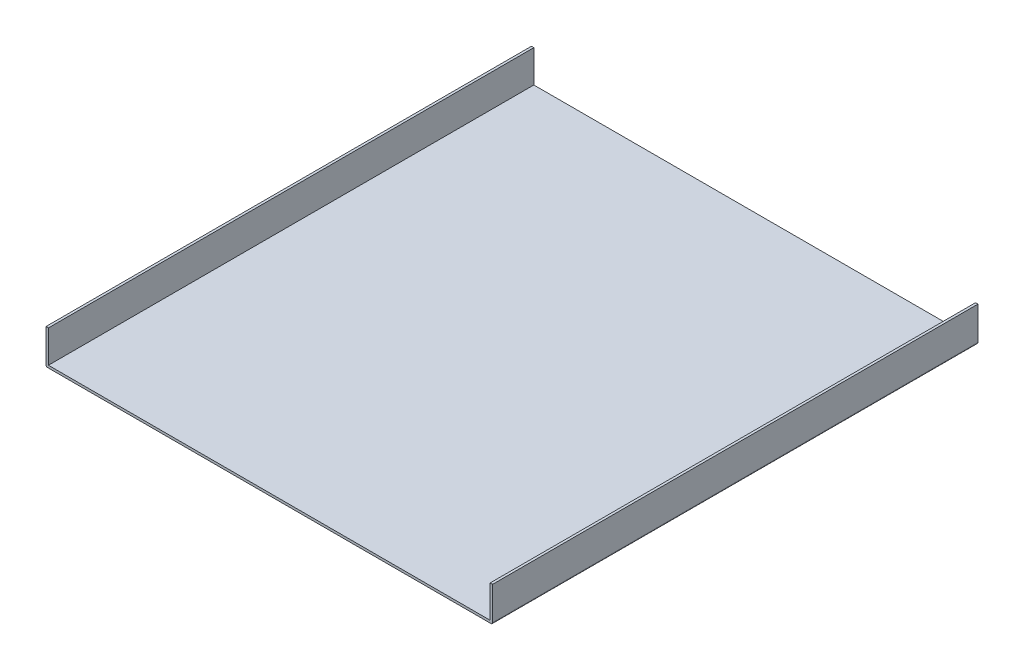
ISO-10303-21;
HEADER;
FILE_DESCRIPTION(('STEP AP214'),'2;1');
FILE_NAME('part.step','',(''),(''),'','','');
FILE_SCHEMA(('AUTOMOTIVE_DESIGN { 1 0 10303 214 1 1 1 1 }'));
ENDSEC;
DATA;
#1=APPLICATION_CONTEXT('core data for automotive mechanical design processes');
#2=APPLICATION_PROTOCOL_DEFINITION('international standard','automotive_design',2000,#1);
#3=PRODUCT_CONTEXT('',#1,'mechanical');
#4=PRODUCT('Part','Part','',(#3));
#5=PRODUCT_RELATED_PRODUCT_CATEGORY('part','',(#4));
#6=PRODUCT_DEFINITION_FORMATION('','',#4);
#7=PRODUCT_DEFINITION_CONTEXT('part definition',#1,'design');
#8=PRODUCT_DEFINITION('design','',#6,#7);
#9=PRODUCT_DEFINITION_SHAPE('','',#8);
#10=(LENGTH_UNIT() NAMED_UNIT(*) SI_UNIT(.MILLI.,.METRE.));
#11=(NAMED_UNIT(*) PLANE_ANGLE_UNIT() SI_UNIT($,.RADIAN.));
#12=(NAMED_UNIT(*) SI_UNIT($,.STERADIAN.) SOLID_ANGLE_UNIT());
#13=UNCERTAINTY_MEASURE_WITH_UNIT(LENGTH_MEASURE(1.E-05),#10,'distance_accuracy_value','');
#14=(GEOMETRIC_REPRESENTATION_CONTEXT(3) GLOBAL_UNCERTAINTY_ASSIGNED_CONTEXT((#13)) GLOBAL_UNIT_ASSIGNED_CONTEXT((#10,
#11,#12)) REPRESENTATION_CONTEXT('',''));
#15=CARTESIAN_POINT('',(0.,0.,0.));
#16=DIRECTION('',(0.,0.,1.));
#17=DIRECTION('',(1.,0.,0.));
#18=AXIS2_PLACEMENT_3D('',#15,#16,#17);
#19=CARTESIAN_POINT('',(0.,1.5,0.));
#20=DIRECTION('',(0.,1.,0.));
#21=DIRECTION('',(0.,0.,1.));
#22=AXIS2_PLACEMENT_3D('',#19,#20,#21);
#23=PLANE('',#22);
#24=DIRECTION('',(1.,0.,0.));
#25=VECTOR('',#24,1.);
#26=CARTESIAN_POINT('',(-138.,1.5,150.));
#27=LINE('',#26,#25);
#28=CARTESIAN_POINT('',(-136.5,1.5,150.));
#29=VERTEX_POINT('',#28);
#30=CARTESIAN_POINT('',(136.5,1.5,150.));
#31=VERTEX_POINT('',#30);
#32=EDGE_CURVE('E189',#29,#31,#27,.T.);
#33=ORIENTED_EDGE('',*,*,#32,.T.);
#34=DIRECTION('',(0.,0.,1.));
#35=VECTOR('',#34,1.);
#36=CARTESIAN_POINT('',(136.5,1.5,150.));
#37=LINE('',#36,#35);
#38=CARTESIAN_POINT('',(136.5,1.5,-150.));
#39=VERTEX_POINT('',#38);
#40=EDGE_CURVE('E146',#39,#31,#37,.T.);
#41=ORIENTED_EDGE('',*,*,#40,.F.);
#42=DIRECTION('',(1.,0.,0.));
#43=VECTOR('',#42,1.);
#44=CARTESIAN_POINT('',(-138.,1.5,-150.));
#45=LINE('',#44,#43);
#46=CARTESIAN_POINT('',(-136.5,1.5,-150.));
#47=VERTEX_POINT('',#46);
#48=EDGE_CURVE('E192',#47,#39,#45,.T.);
#49=ORIENTED_EDGE('',*,*,#48,.F.);
#50=DIRECTION('',(0.,0.,-1.));
#51=VECTOR('',#50,1.);
#52=CARTESIAN_POINT('',(-136.5,1.5,150.));
#53=LINE('',#52,#51);
#54=EDGE_CURVE('E162',#29,#47,#53,.T.);
#55=ORIENTED_EDGE('',*,*,#54,.F.);
#56=EDGE_LOOP('',(#33,#41,#49,#55));
#57=FACE_BOUND('',#56,.T.);
#58=ADVANCED_FACE('F38',(#57),#23,.T.);
#59=CARTESIAN_POINT('',(-138.,1.5,150.));
#60=DIRECTION('',(0.,0.,-1.));
#61=DIRECTION('',(-1.,0.,0.));
#62=AXIS2_PLACEMENT_3D('',#59,#60,#61);
#63=PLANE('',#62);
#64=DIRECTION('',(0.,-1.,0.));
#65=VECTOR('',#64,1.);
#66=CARTESIAN_POINT('',(-138.,1.5,150.));
#67=LINE('',#66,#65);
#68=CARTESIAN_POINT('',(-138.,21.5,150.));
#69=VERTEX_POINT('',#68);
#70=CARTESIAN_POINT('',(-138.,1.,150.));
#71=VERTEX_POINT('',#70);
#72=EDGE_CURVE('E196',#69,#71,#67,.T.);
#73=ORIENTED_EDGE('',*,*,#72,.T.);
#74=CARTESIAN_POINT('',(-137.,1.,150.));
#75=DIRECTION('',(0.,0.,-1.));
#76=DIRECTION('',(-1.,0.,0.));
#77=AXIS2_PLACEMENT_3D('',#74,#75,#76);
#78=CIRCLE('',#77,1.);
#79=CARTESIAN_POINT('',(-137.,0.,150.));
#80=VERTEX_POINT('',#79);
#81=EDGE_CURVE('E47',#71,#80,#78,.F.);
#82=ORIENTED_EDGE('',*,*,#81,.T.);
#83=DIRECTION('',(1.,0.,0.));
#84=VECTOR('',#83,1.);
#85=CARTESIAN_POINT('',(-138.,0.,150.));
#86=LINE('',#85,#84);
#87=CARTESIAN_POINT('',(137.,0.,150.));
#88=VERTEX_POINT('',#87);
#89=EDGE_CURVE('E188',#80,#88,#86,.T.);
#90=ORIENTED_EDGE('',*,*,#89,.T.);
#91=CARTESIAN_POINT('',(137.,1.,150.));
#92=DIRECTION('',(0.,0.,-1.));
#93=DIRECTION('',(-1.,0.,0.));
#94=AXIS2_PLACEMENT_3D('',#91,#92,#93);
#95=CIRCLE('',#94,1.);
#96=CARTESIAN_POINT('',(138.,1.,150.));
#97=VERTEX_POINT('',#96);
#98=EDGE_CURVE('E54',#88,#97,#95,.F.);
#99=ORIENTED_EDGE('',*,*,#98,.T.);
#100=DIRECTION('',(0.,-1.,0.));
#101=VECTOR('',#100,1.);
#102=CARTESIAN_POINT('',(138.,1.5,150.));
#103=LINE('',#102,#101);
#104=CARTESIAN_POINT('',(138.,21.5,150.));
#105=VERTEX_POINT('',#104);
#106=EDGE_CURVE('E126',#105,#97,#103,.T.);
#107=ORIENTED_EDGE('',*,*,#106,.F.);
#108=DIRECTION('',(1.,0.,0.));
#109=VECTOR('',#108,1.);
#110=CARTESIAN_POINT('',(138.,21.5,150.));
#111=LINE('',#110,#109);
#112=CARTESIAN_POINT('',(136.5,21.5,150.));
#113=VERTEX_POINT('',#112);
#114=EDGE_CURVE('E144',#113,#105,#111,.T.);
#115=ORIENTED_EDGE('',*,*,#114,.F.);
#116=DIRECTION('',(0.,-1.,0.));
#117=VECTOR('',#116,1.);
#118=CARTESIAN_POINT('',(136.5,21.5,150.));
#119=LINE('',#118,#117);
#120=EDGE_CURVE('E155',#113,#31,#119,.T.);
#121=ORIENTED_EDGE('',*,*,#120,.T.);
#122=ORIENTED_EDGE('',*,*,#32,.F.);
#123=DIRECTION('',(0.,-1.,0.));
#124=VECTOR('',#123,1.);
#125=CARTESIAN_POINT('',(-136.5,21.5,150.));
#126=LINE('',#125,#124);
#127=CARTESIAN_POINT('',(-136.5,21.5,150.));
#128=VERTEX_POINT('',#127);
#129=EDGE_CURVE('E184',#128,#29,#126,.T.);
#130=ORIENTED_EDGE('',*,*,#129,.F.);
#131=DIRECTION('',(1.,0.,0.));
#132=VECTOR('',#131,1.);
#133=CARTESIAN_POINT('',(-138.,21.5,150.));
#134=LINE('',#133,#132);
#135=EDGE_CURVE('E167',#69,#128,#134,.T.);
#136=ORIENTED_EDGE('',*,*,#135,.F.);
#137=EDGE_LOOP('',(#73,#82,#90,#99,#107,#115,#121,#122,#130,#136));
#138=FACE_BOUND('',#137,.T.);
#139=ADVANCED_FACE('F227',(#138),#63,.F.);
#140=CARTESIAN_POINT('',(138.,1.5,150.));
#141=DIRECTION('',(-1.,0.,0.));
#142=DIRECTION('',(0.,0.,1.));
#143=AXIS2_PLACEMENT_3D('',#140,#141,#142);
#144=PLANE('',#143);
#145=ORIENTED_EDGE('',*,*,#106,.T.);
#146=DIRECTION('',(0.,0.,-1.));
#147=VECTOR('',#146,1.);
#148=CARTESIAN_POINT('',(138.,1.,150.));
#149=LINE('',#148,#147);
#150=CARTESIAN_POINT('',(138.,1.,-150.));
#151=VERTEX_POINT('',#150);
#152=EDGE_CURVE('E11',#97,#151,#149,.T.);
#153=ORIENTED_EDGE('',*,*,#152,.T.);
#154=DIRECTION('',(0.,-1.,0.));
#155=VECTOR('',#154,1.);
#156=CARTESIAN_POINT('',(138.,1.5,-150.));
#157=LINE('',#156,#155);
#158=CARTESIAN_POINT('',(138.,21.5,-150.));
#159=VERTEX_POINT('',#158);
#160=EDGE_CURVE('E118',#159,#151,#157,.T.);
#161=ORIENTED_EDGE('',*,*,#160,.F.);
#162=DIRECTION('',(0.,0.,-1.));
#163=VECTOR('',#162,1.);
#164=CARTESIAN_POINT('',(138.,21.5,150.));
#165=LINE('',#164,#163);
#166=EDGE_CURVE('E122',#105,#159,#165,.T.);
#167=ORIENTED_EDGE('',*,*,#166,.F.);
#168=EDGE_LOOP('',(#145,#153,#161,#167));
#169=FACE_BOUND('',#168,.T.);
#170=ADVANCED_FACE('F120',(#169),#144,.F.);
#171=CARTESIAN_POINT('',(-138.,1.5,-150.));
#172=DIRECTION('',(0.,0.,-1.));
#173=DIRECTION('',(-1.,0.,0.));
#174=AXIS2_PLACEMENT_3D('',#171,#172,#173);
#175=PLANE('',#174);
#176=DIRECTION('',(1.,0.,0.));
#177=VECTOR('',#176,1.);
#178=CARTESIAN_POINT('',(-138.,0.,-150.));
#179=LINE('',#178,#177);
#180=CARTESIAN_POINT('',(-137.,0.,-150.));
#181=VERTEX_POINT('',#180);
#182=CARTESIAN_POINT('',(137.,0.,-150.));
#183=VERTEX_POINT('',#182);
#184=EDGE_CURVE('E193',#181,#183,#179,.T.);
#185=ORIENTED_EDGE('',*,*,#184,.F.);
#186=CARTESIAN_POINT('',(-137.,1.,-150.));
#187=DIRECTION('',(0.,0.,-1.));
#188=DIRECTION('',(-1.,0.,0.));
#189=AXIS2_PLACEMENT_3D('',#186,#187,#188);
#190=CIRCLE('',#189,1.);
#191=CARTESIAN_POINT('',(-138.,1.,-150.));
#192=VERTEX_POINT('',#191);
#193=EDGE_CURVE('E218',#181,#192,#190,.T.);
#194=ORIENTED_EDGE('',*,*,#193,.T.);
#195=DIRECTION('',(0.,-1.,0.));
#196=VECTOR('',#195,1.);
#197=CARTESIAN_POINT('',(-138.,1.5,-150.));
#198=LINE('',#197,#196);
#199=CARTESIAN_POINT('',(-138.,21.5,-150.));
#200=VERTEX_POINT('',#199);
#201=EDGE_CURVE('E127',#200,#192,#198,.T.);
#202=ORIENTED_EDGE('',*,*,#201,.F.);
#203=DIRECTION('',(-1.,0.,0.));
#204=VECTOR('',#203,1.);
#205=CARTESIAN_POINT('',(-138.,21.5,-150.));
#206=LINE('',#205,#204);
#207=CARTESIAN_POINT('',(-136.5,21.5,-150.));
#208=VERTEX_POINT('',#207);
#209=EDGE_CURVE('E173',#208,#200,#206,.T.);
#210=ORIENTED_EDGE('',*,*,#209,.F.);
#211=DIRECTION('',(0.,-1.,0.));
#212=VECTOR('',#211,1.);
#213=CARTESIAN_POINT('',(-136.5,21.5,-150.));
#214=LINE('',#213,#212);
#215=EDGE_CURVE('E177',#208,#47,#214,.T.);
#216=ORIENTED_EDGE('',*,*,#215,.T.);
#217=ORIENTED_EDGE('',*,*,#48,.T.);
#218=DIRECTION('',(0.,-1.,0.));
#219=VECTOR('',#218,1.);
#220=CARTESIAN_POINT('',(136.5,21.5,-150.));
#221=LINE('',#220,#219);
#222=CARTESIAN_POINT('',(136.5,21.5,-150.));
#223=VERTEX_POINT('',#222);
#224=EDGE_CURVE('E135',#223,#39,#221,.T.);
#225=ORIENTED_EDGE('',*,*,#224,.F.);
#226=DIRECTION('',(-1.,0.,0.));
#227=VECTOR('',#226,1.);
#228=CARTESIAN_POINT('',(138.,21.5,-150.));
#229=LINE('',#228,#227);
#230=EDGE_CURVE('E130',#159,#223,#229,.T.);
#231=ORIENTED_EDGE('',*,*,#230,.F.);
#232=ORIENTED_EDGE('',*,*,#160,.T.);
#233=CARTESIAN_POINT('',(137.,1.,-150.));
#234=DIRECTION('',(0.,0.,-1.));
#235=DIRECTION('',(-1.,0.,0.));
#236=AXIS2_PLACEMENT_3D('',#233,#234,#235);
#237=CIRCLE('',#236,1.);
#238=EDGE_CURVE('E215',#151,#183,#237,.T.);
#239=ORIENTED_EDGE('',*,*,#238,.T.);
#240=EDGE_LOOP('',(#185,#194,#202,#210,#216,#217,#225,#231,#232,#239));
#241=FACE_BOUND('',#240,.T.);
#242=ADVANCED_FACE('F132',(#241),#175,.T.);
#243=CARTESIAN_POINT('',(-138.,1.5,150.));
#244=DIRECTION('',(-1.,0.,0.));
#245=DIRECTION('',(0.,0.,1.));
#246=AXIS2_PLACEMENT_3D('',#243,#244,#245);
#247=PLANE('',#246);
#248=ORIENTED_EDGE('',*,*,#201,.T.);
#249=DIRECTION('',(0.,0.,-1.));
#250=VECTOR('',#249,1.);
#251=CARTESIAN_POINT('',(-138.,1.,150.));
#252=LINE('',#251,#250);
#253=EDGE_CURVE('E62',#192,#71,#252,.F.);
#254=ORIENTED_EDGE('',*,*,#253,.T.);
#255=ORIENTED_EDGE('',*,*,#72,.F.);
#256=DIRECTION('',(0.,0.,1.));
#257=VECTOR('',#256,1.);
#258=CARTESIAN_POINT('',(-138.,21.5,150.));
#259=LINE('',#258,#257);
#260=EDGE_CURVE('E163',#200,#69,#259,.T.);
#261=ORIENTED_EDGE('',*,*,#260,.F.);
#262=EDGE_LOOP('',(#248,#254,#255,#261));
#263=FACE_BOUND('',#262,.T.);
#264=ADVANCED_FACE('F237',(#263),#247,.T.);
#265=CARTESIAN_POINT('',(0.,0.,0.));
#266=DIRECTION('',(0.,1.,0.));
#267=DIRECTION('',(0.,0.,1.));
#268=AXIS2_PLACEMENT_3D('',#265,#266,#267);
#269=PLANE('',#268);
#270=ORIENTED_EDGE('',*,*,#89,.F.);
#271=DIRECTION('',(0.,0.,-1.));
#272=VECTOR('',#271,1.);
#273=CARTESIAN_POINT('',(-137.,0.,-150.));
#274=LINE('',#273,#272);
#275=EDGE_CURVE('E211',#80,#181,#274,.T.);
#276=ORIENTED_EDGE('',*,*,#275,.T.);
#277=ORIENTED_EDGE('',*,*,#184,.T.);
#278=DIRECTION('',(0.,0.,-1.));
#279=VECTOR('',#278,1.);
#280=CARTESIAN_POINT('',(137.,0.,0.));
#281=LINE('',#280,#279);
#282=EDGE_CURVE('E208',#183,#88,#281,.F.);
#283=ORIENTED_EDGE('',*,*,#282,.T.);
#284=EDGE_LOOP('',(#270,#276,#277,#283));
#285=FACE_BOUND('',#284,.T.);
#286=ADVANCED_FACE('F232',(#285),#269,.F.);
#287=CARTESIAN_POINT('',(-136.5,21.5,150.));
#288=DIRECTION('',(-1.,0.,0.));
#289=DIRECTION('',(0.,0.,1.));
#290=AXIS2_PLACEMENT_3D('',#287,#288,#289);
#291=PLANE('',#290);
#292=ORIENTED_EDGE('',*,*,#54,.T.);
#293=ORIENTED_EDGE('',*,*,#215,.F.);
#294=DIRECTION('',(0.,0.,-1.));
#295=VECTOR('',#294,1.);
#296=CARTESIAN_POINT('',(-136.5,21.5,150.));
#297=LINE('',#296,#295);
#298=EDGE_CURVE('E170',#128,#208,#297,.T.);
#299=ORIENTED_EDGE('',*,*,#298,.F.);
#300=ORIENTED_EDGE('',*,*,#129,.T.);
#301=EDGE_LOOP('',(#292,#293,#299,#300));
#302=FACE_BOUND('',#301,.T.);
#303=ADVANCED_FACE('F244',(#302),#291,.F.);
#304=CARTESIAN_POINT('',(0.,21.5,0.));
#305=DIRECTION('',(0.,-1.,0.));
#306=DIRECTION('',(0.,0.,-1.));
#307=AXIS2_PLACEMENT_3D('',#304,#305,#306);
#308=PLANE('',#307);
#309=ORIENTED_EDGE('',*,*,#260,.T.);
#310=ORIENTED_EDGE('',*,*,#135,.T.);
#311=ORIENTED_EDGE('',*,*,#298,.T.);
#312=ORIENTED_EDGE('',*,*,#209,.T.);
#313=EDGE_LOOP('',(#309,#310,#311,#312));
#314=FACE_BOUND('',#313,.T.);
#315=ADVANCED_FACE('F239',(#314),#308,.F.);
#316=CARTESIAN_POINT('',(136.5,21.5,150.));
#317=DIRECTION('',(1.,0.,0.));
#318=DIRECTION('',(0.,0.,-1.));
#319=AXIS2_PLACEMENT_3D('',#316,#317,#318);
#320=PLANE('',#319);
#321=ORIENTED_EDGE('',*,*,#40,.T.);
#322=ORIENTED_EDGE('',*,*,#120,.F.);
#323=DIRECTION('',(0.,0.,1.));
#324=VECTOR('',#323,1.);
#325=CARTESIAN_POINT('',(136.5,21.5,150.));
#326=LINE('',#325,#324);
#327=EDGE_CURVE('E139',#223,#113,#326,.T.);
#328=ORIENTED_EDGE('',*,*,#327,.F.);
#329=ORIENTED_EDGE('',*,*,#224,.T.);
#330=EDGE_LOOP('',(#321,#322,#328,#329));
#331=FACE_BOUND('',#330,.T.);
#332=ADVANCED_FACE('F249',(#331),#320,.F.);
#333=CARTESIAN_POINT('',(0.,21.5,0.));
#334=DIRECTION('',(0.,1.,0.));
#335=DIRECTION('',(0.,0.,1.));
#336=AXIS2_PLACEMENT_3D('',#333,#334,#335);
#337=PLANE('',#336);
#338=ORIENTED_EDGE('',*,*,#166,.T.);
#339=ORIENTED_EDGE('',*,*,#230,.T.);
#340=ORIENTED_EDGE('',*,*,#327,.T.);
#341=ORIENTED_EDGE('',*,*,#114,.T.);
#342=EDGE_LOOP('',(#338,#339,#340,#341));
#343=FACE_BOUND('',#342,.T.);
#344=ADVANCED_FACE('F142',(#343),#337,.T.);
#345=CARTESIAN_POINT('',(-137.,1.,0.));
#346=DIRECTION('',(0.,0.,1.));
#347=DIRECTION('',(1.,0.,0.));
#348=AXIS2_PLACEMENT_3D('',#345,#346,#347);
#349=CYLINDRICAL_SURFACE('',#348,1.);
#350=ORIENTED_EDGE('',*,*,#81,.F.);
#351=ORIENTED_EDGE('',*,*,#253,.F.);
#352=ORIENTED_EDGE('',*,*,#193,.F.);
#353=ORIENTED_EDGE('',*,*,#275,.F.);
#354=EDGE_LOOP('',(#350,#351,#352,#353));
#355=FACE_BOUND('',#354,.T.);
#356=ADVANCED_FACE('F234',(#355),#349,.T.);
#357=CARTESIAN_POINT('',(137.,1.,150.));
#358=DIRECTION('',(0.,0.,-1.));
#359=DIRECTION('',(-1.,0.,0.));
#360=AXIS2_PLACEMENT_3D('',#357,#358,#359);
#361=CYLINDRICAL_SURFACE('',#360,1.);
#362=ORIENTED_EDGE('',*,*,#98,.F.);
#363=ORIENTED_EDGE('',*,*,#282,.F.);
#364=ORIENTED_EDGE('',*,*,#238,.F.);
#365=ORIENTED_EDGE('',*,*,#152,.F.);
#366=EDGE_LOOP('',(#362,#363,#364,#365));
#367=FACE_BOUND('',#366,.T.);
#368=ADVANCED_FACE('F40',(#367),#361,.T.);
#369=CLOSED_SHELL('',(#58,#139,#170,#242,#264,#286,#303,#315,#332,#344,#356,#368));
#370=MANIFOLD_SOLID_BREP('B2',#369);
#371=ADVANCED_BREP_SHAPE_REPRESENTATION('',(#18,#370),#14);
#372=SHAPE_DEFINITION_REPRESENTATION(#9,#371);
ENDSEC;
END-ISO-10303-21;
